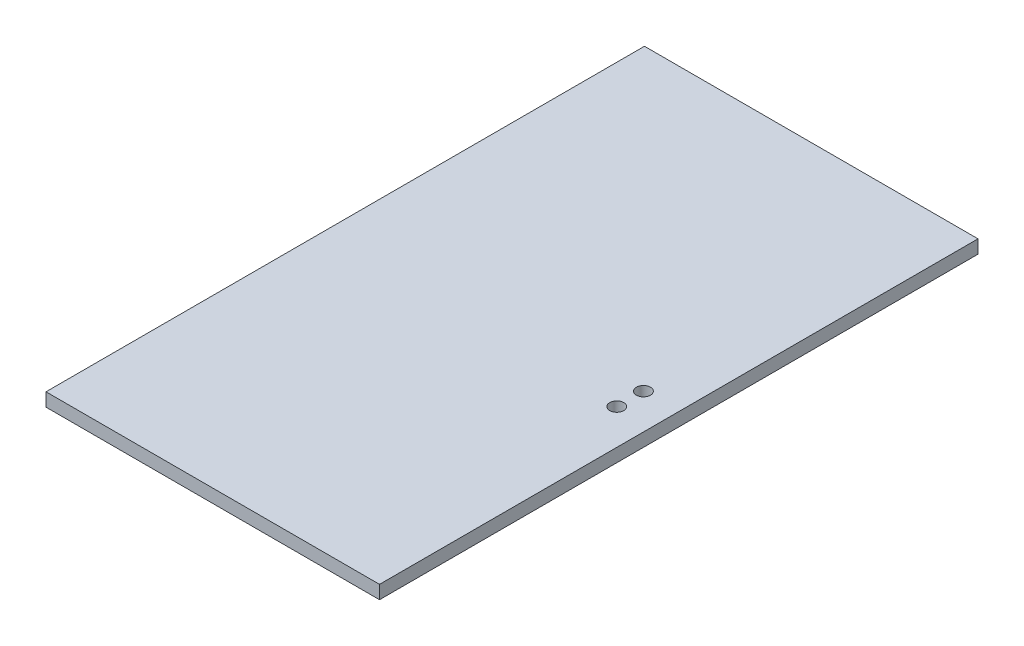
ISO-10303-21;
HEADER;
FILE_DESCRIPTION(('STEP AP214'),'2;1');
FILE_NAME('part.step','',(''),(''),'','','');
FILE_SCHEMA(('AUTOMOTIVE_DESIGN { 1 0 10303 214 1 1 1 1 }'));
ENDSEC;
DATA;
#1=APPLICATION_CONTEXT('core data for automotive mechanical design processes');
#2=APPLICATION_PROTOCOL_DEFINITION('international standard','automotive_design',2000,#1);
#3=PRODUCT_CONTEXT('',#1,'mechanical');
#4=PRODUCT('Part','Part','',(#3));
#5=PRODUCT_RELATED_PRODUCT_CATEGORY('part','',(#4));
#6=PRODUCT_DEFINITION_FORMATION('','',#4);
#7=PRODUCT_DEFINITION_CONTEXT('part definition',#1,'design');
#8=PRODUCT_DEFINITION('design','',#6,#7);
#9=PRODUCT_DEFINITION_SHAPE('','',#8);
#10=(LENGTH_UNIT() NAMED_UNIT(*) SI_UNIT(.MILLI.,.METRE.));
#11=(NAMED_UNIT(*) PLANE_ANGLE_UNIT() SI_UNIT($,.RADIAN.));
#12=(NAMED_UNIT(*) SI_UNIT($,.STERADIAN.) SOLID_ANGLE_UNIT());
#13=UNCERTAINTY_MEASURE_WITH_UNIT(LENGTH_MEASURE(1.E-05),#10,'distance_accuracy_value','');
#14=(GEOMETRIC_REPRESENTATION_CONTEXT(3) GLOBAL_UNCERTAINTY_ASSIGNED_CONTEXT((#13)) GLOBAL_UNIT_ASSIGNED_CONTEXT((#10,
#11,#12)) REPRESENTATION_CONTEXT('',''));
#15=CARTESIAN_POINT('',(0.,0.,0.));
#16=DIRECTION('',(0.,0.,1.));
#17=DIRECTION('',(1.,0.,0.));
#18=AXIS2_PLACEMENT_3D('',#15,#16,#17);
#19=CARTESIAN_POINT('',(75.,0.,0.));
#20=DIRECTION('',(0.,1.,0.));
#21=DIRECTION('',(0.,0.,1.));
#22=AXIS2_PLACEMENT_3D('',#19,#20,#21);
#23=PLANE('',#22);
#24=CARTESIAN_POINT('',(67.0591774961835,0.,-61.29));
#25=DIRECTION('',(0.,1.,0.));
#26=DIRECTION('',(0.,0.,1.));
#27=AXIS2_PLACEMENT_3D('',#24,#25,#26);
#28=CIRCLE('',#27,1.57499999999999);
#29=CARTESIAN_POINT('',(67.0591774961835,0.,-59.715));
#30=VERTEX_POINT('',#29);
#31=EDGE_CURVE('E190',#30,#30,#28,.T.);
#32=ORIENTED_EDGE('',*,*,#31,.T.);
#33=EDGE_LOOP('',(#32));
#34=FACE_BOUND('',#33,.T.);
#35=CARTESIAN_POINT('',(67.0591774961835,0.,-67.29));
#36=DIRECTION('',(0.,1.,0.));
#37=DIRECTION('',(0.,0.,1.));
#38=AXIS2_PLACEMENT_3D('',#35,#36,#37);
#39=CIRCLE('',#38,1.57499999999999);
#40=CARTESIAN_POINT('',(67.0591774961835,0.,-65.715));
#41=VERTEX_POINT('',#40);
#42=EDGE_CURVE('E271',#41,#41,#39,.T.);
#43=ORIENTED_EDGE('',*,*,#42,.T.);
#44=EDGE_LOOP('',(#43));
#45=FACE_BOUND('',#44,.T.);
#46=DIRECTION('',(-1.,0.,0.));
#47=VECTOR('',#46,1.);
#48=CARTESIAN_POINT('',(0.,0.,-12.1));
#49=LINE('',#48,#47);
#50=CARTESIAN_POINT('',(3.,0.,-12.1));
#51=VERTEX_POINT('',#50);
#52=CARTESIAN_POINT('',(0.,0.,-12.1));
#53=VERTEX_POINT('',#52);
#54=EDGE_CURVE('E56',#51,#53,#49,.T.);
#55=ORIENTED_EDGE('',*,*,#54,.F.);
#56=DIRECTION('',(0.,0.,1.));
#57=VECTOR('',#56,1.);
#58=CARTESIAN_POINT('',(3.,0.,-12.1));
#59=LINE('',#58,#57);
#60=CARTESIAN_POINT('',(3.00000000000001,0.,-47.1));
#61=VERTEX_POINT('',#60);
#62=EDGE_CURVE('E202',#61,#51,#59,.T.);
#63=ORIENTED_EDGE('',*,*,#62,.F.);
#64=DIRECTION('',(1.,0.,0.));
#65=VECTOR('',#64,1.);
#66=CARTESIAN_POINT('',(0.,0.,-47.1));
#67=LINE('',#66,#65);
#68=CARTESIAN_POINT('',(0.,0.,-47.1));
#69=VERTEX_POINT('',#68);
#70=EDGE_CURVE('E62',#69,#61,#67,.T.);
#71=ORIENTED_EDGE('',*,*,#70,.F.);
#72=DIRECTION('',(0.,0.,-1.));
#73=VECTOR('',#72,1.);
#74=CARTESIAN_POINT('',(0.,0.,0.));
#75=LINE('',#74,#73);
#76=CARTESIAN_POINT('',(0.,0.,-134.58));
#77=VERTEX_POINT('',#76);
#78=EDGE_CURVE('E130',#69,#77,#75,.T.);
#79=ORIENTED_EDGE('',*,*,#78,.T.);
#80=DIRECTION('',(-1.,0.,0.));
#81=VECTOR('',#80,1.);
#82=CARTESIAN_POINT('',(75.,0.,-134.58));
#83=LINE('',#82,#81);
#84=CARTESIAN_POINT('',(75.,0.,-134.58));
#85=VERTEX_POINT('',#84);
#86=EDGE_CURVE('E48',#85,#77,#83,.T.);
#87=ORIENTED_EDGE('',*,*,#86,.F.);
#88=DIRECTION('',(0.,0.,-1.));
#89=VECTOR('',#88,1.);
#90=CARTESIAN_POINT('',(75.,0.,0.));
#91=LINE('',#90,#89);
#92=CARTESIAN_POINT('',(75.,0.,0.));
#93=VERTEX_POINT('',#92);
#94=EDGE_CURVE('E146',#93,#85,#91,.T.);
#95=ORIENTED_EDGE('',*,*,#94,.F.);
#96=DIRECTION('',(-1.,0.,0.));
#97=VECTOR('',#96,1.);
#98=CARTESIAN_POINT('',(75.,0.,0.));
#99=LINE('',#98,#97);
#100=CARTESIAN_POINT('',(0.,0.,0.));
#101=VERTEX_POINT('',#100);
#102=EDGE_CURVE('E11',#93,#101,#99,.T.);
#103=ORIENTED_EDGE('',*,*,#102,.T.);
#104=EDGE_CURVE('E157',#101,#53,#75,.T.);
#105=ORIENTED_EDGE('',*,*,#104,.T.);
#106=EDGE_LOOP('',(#55,#63,#71,#79,#87,#95,#103,#105));
#107=FACE_BOUND('',#106,.T.);
#108=ADVANCED_FACE('F38',(#34,#45,#107),#23,.F.);
#109=CARTESIAN_POINT('',(75.,0.,0.));
#110=DIRECTION('',(0.,0.,-1.));
#111=DIRECTION('',(-1.,0.,0.));
#112=AXIS2_PLACEMENT_3D('',#109,#110,#111);
#113=PLANE('',#112);
#114=DIRECTION('',(0.,-1.,0.));
#115=VECTOR('',#114,1.);
#116=CARTESIAN_POINT('',(0.,0.,0.));
#117=LINE('',#116,#115);
#118=CARTESIAN_POINT('',(0.,3.,0.));
#119=VERTEX_POINT('',#118);
#120=EDGE_CURVE('E132',#119,#101,#117,.T.);
#121=ORIENTED_EDGE('',*,*,#120,.T.);
#122=ORIENTED_EDGE('',*,*,#102,.F.);
#123=DIRECTION('',(0.,-1.,0.));
#124=VECTOR('',#123,1.);
#125=CARTESIAN_POINT('',(75.,0.,0.));
#126=LINE('',#125,#124);
#127=CARTESIAN_POINT('',(75.,3.,0.));
#128=VERTEX_POINT('',#127);
#129=EDGE_CURVE('E142',#128,#93,#126,.T.);
#130=ORIENTED_EDGE('',*,*,#129,.F.);
#131=DIRECTION('',(-1.,0.,0.));
#132=VECTOR('',#131,1.);
#133=CARTESIAN_POINT('',(75.,3.,0.));
#134=LINE('',#133,#132);
#135=EDGE_CURVE('E155',#128,#119,#134,.T.);
#136=ORIENTED_EDGE('',*,*,#135,.T.);
#137=EDGE_LOOP('',(#121,#122,#130,#136));
#138=FACE_BOUND('',#137,.T.);
#139=ADVANCED_FACE('F40',(#138),#113,.F.);
#140=CARTESIAN_POINT('',(75.,0.,-134.58));
#141=DIRECTION('',(0.,0.,1.));
#142=DIRECTION('',(1.,0.,0.));
#143=AXIS2_PLACEMENT_3D('',#140,#141,#142);
#144=PLANE('',#143);
#145=DIRECTION('',(0.,1.,0.));
#146=VECTOR('',#145,1.);
#147=CARTESIAN_POINT('',(0.,0.,-134.58));
#148=LINE('',#147,#146);
#149=CARTESIAN_POINT('',(0.,3.,-134.58));
#150=VERTEX_POINT('',#149);
#151=EDGE_CURVE('E160',#77,#150,#148,.T.);
#152=ORIENTED_EDGE('',*,*,#151,.T.);
#153=DIRECTION('',(-1.,0.,0.));
#154=VECTOR('',#153,1.);
#155=CARTESIAN_POINT('',(75.,3.,-134.58));
#156=LINE('',#155,#154);
#157=CARTESIAN_POINT('',(75.,3.,-134.58));
#158=VERTEX_POINT('',#157);
#159=EDGE_CURVE('E168',#158,#150,#156,.T.);
#160=ORIENTED_EDGE('',*,*,#159,.F.);
#161=DIRECTION('',(0.,1.,0.));
#162=VECTOR('',#161,1.);
#163=CARTESIAN_POINT('',(75.,0.,-134.58));
#164=LINE('',#163,#162);
#165=EDGE_CURVE('E150',#85,#158,#164,.T.);
#166=ORIENTED_EDGE('',*,*,#165,.F.);
#167=ORIENTED_EDGE('',*,*,#86,.T.);
#168=EDGE_LOOP('',(#152,#160,#166,#167));
#169=FACE_BOUND('',#168,.T.);
#170=ADVANCED_FACE('F222',(#169),#144,.F.);
#171=CARTESIAN_POINT('',(75.,3.,0.));
#172=DIRECTION('',(0.,-1.,0.));
#173=DIRECTION('',(0.,0.,-1.));
#174=AXIS2_PLACEMENT_3D('',#171,#172,#173);
#175=PLANE('',#174);
#176=CARTESIAN_POINT('',(67.0591774961835,3.,-61.29));
#177=DIRECTION('',(0.,1.,0.));
#178=DIRECTION('',(0.,0.,1.));
#179=AXIS2_PLACEMENT_3D('',#176,#177,#178);
#180=CIRCLE('',#179,1.57499999999999);
#181=CARTESIAN_POINT('',(67.0591774961835,3.,-59.715));
#182=VERTEX_POINT('',#181);
#183=EDGE_CURVE('E268',#182,#182,#180,.T.);
#184=ORIENTED_EDGE('',*,*,#183,.F.);
#185=EDGE_LOOP('',(#184));
#186=FACE_BOUND('',#185,.T.);
#187=CARTESIAN_POINT('',(67.0591774961835,3.,-67.29));
#188=DIRECTION('',(0.,1.,0.));
#189=DIRECTION('',(0.,0.,1.));
#190=AXIS2_PLACEMENT_3D('',#187,#188,#189);
#191=CIRCLE('',#190,1.57499999999999);
#192=CARTESIAN_POINT('',(67.0591774961835,3.,-65.715));
#193=VERTEX_POINT('',#192);
#194=EDGE_CURVE('E276',#193,#193,#191,.T.);
#195=ORIENTED_EDGE('',*,*,#194,.F.);
#196=EDGE_LOOP('',(#195));
#197=FACE_BOUND('',#196,.T.);
#198=DIRECTION('',(0.,0.,1.));
#199=VECTOR('',#198,1.);
#200=CARTESIAN_POINT('',(0.,3.,0.));
#201=LINE('',#200,#199);
#202=EDGE_CURVE('E147',#150,#119,#201,.T.);
#203=ORIENTED_EDGE('',*,*,#202,.T.);
#204=ORIENTED_EDGE('',*,*,#135,.F.);
#205=DIRECTION('',(0.,0.,1.));
#206=VECTOR('',#205,1.);
#207=CARTESIAN_POINT('',(75.,3.,0.));
#208=LINE('',#207,#206);
#209=EDGE_CURVE('E153',#158,#128,#208,.T.);
#210=ORIENTED_EDGE('',*,*,#209,.F.);
#211=ORIENTED_EDGE('',*,*,#159,.T.);
#212=EDGE_LOOP('',(#203,#204,#210,#211));
#213=FACE_BOUND('',#212,.T.);
#214=ADVANCED_FACE('F229',(#186,#197,#213),#175,.F.);
#215=CARTESIAN_POINT('',(75.,0.,0.));
#216=DIRECTION('',(-1.,0.,0.));
#217=DIRECTION('',(0.,0.,1.));
#218=AXIS2_PLACEMENT_3D('',#215,#216,#217);
#219=PLANE('',#218);
#220=ORIENTED_EDGE('',*,*,#129,.T.);
#221=ORIENTED_EDGE('',*,*,#94,.T.);
#222=ORIENTED_EDGE('',*,*,#165,.T.);
#223=ORIENTED_EDGE('',*,*,#209,.T.);
#224=EDGE_LOOP('',(#220,#221,#222,#223));
#225=FACE_BOUND('',#224,.T.);
#226=ADVANCED_FACE('F232',(#225),#219,.F.);
#227=CARTESIAN_POINT('',(0.,0.,0.));
#228=DIRECTION('',(-1.,0.,0.));
#229=DIRECTION('',(0.,0.,1.));
#230=AXIS2_PLACEMENT_3D('',#227,#228,#229);
#231=PLANE('',#230);
#232=CARTESIAN_POINT('',(0.,-4.5,-23.7666666666667));
#233=DIRECTION('',(-1.,0.,0.));
#234=DIRECTION('',(0.,0.,1.));
#235=AXIS2_PLACEMENT_3D('',#232,#233,#234);
#236=CIRCLE('',#235,1.575);
#237=CARTESIAN_POINT('',(0.,-4.5,-22.1916666666667));
#238=VERTEX_POINT('',#237);
#239=EDGE_CURVE('E177',#238,#238,#236,.T.);
#240=ORIENTED_EDGE('',*,*,#239,.F.);
#241=EDGE_LOOP('',(#240));
#242=FACE_BOUND('',#241,.T.);
#243=CARTESIAN_POINT('',(0.,-4.5,-35.4333333333333));
#244=DIRECTION('',(-1.,0.,0.));
#245=DIRECTION('',(0.,0.,1.));
#246=AXIS2_PLACEMENT_3D('',#243,#244,#245);
#247=CIRCLE('',#246,1.575);
#248=CARTESIAN_POINT('',(0.,-4.5,-33.8583333333333));
#249=VERTEX_POINT('',#248);
#250=EDGE_CURVE('E184',#249,#249,#247,.T.);
#251=ORIENTED_EDGE('',*,*,#250,.F.);
#252=EDGE_LOOP('',(#251));
#253=FACE_BOUND('',#252,.T.);
#254=ORIENTED_EDGE('',*,*,#120,.F.);
#255=ORIENTED_EDGE('',*,*,#202,.F.);
#256=ORIENTED_EDGE('',*,*,#151,.F.);
#257=ORIENTED_EDGE('',*,*,#78,.F.);
#258=DIRECTION('',(0.,1.,0.));
#259=VECTOR('',#258,1.);
#260=CARTESIAN_POINT('',(0.,-9.,-47.1));
#261=LINE('',#260,#259);
#262=CARTESIAN_POINT('',(0.,-9.,-47.1));
#263=VERTEX_POINT('',#262);
#264=EDGE_CURVE('E109',#263,#69,#261,.T.);
#265=ORIENTED_EDGE('',*,*,#264,.F.);
#266=DIRECTION('',(0.,0.,-1.));
#267=VECTOR('',#266,1.);
#268=CARTESIAN_POINT('',(0.,-9.,-12.1));
#269=LINE('',#268,#267);
#270=CARTESIAN_POINT('',(0.,-9.,-12.1));
#271=VERTEX_POINT('',#270);
#272=EDGE_CURVE('E116',#271,#263,#269,.T.);
#273=ORIENTED_EDGE('',*,*,#272,.F.);
#274=DIRECTION('',(0.,1.,0.));
#275=VECTOR('',#274,1.);
#276=CARTESIAN_POINT('',(0.,-9.,-12.1));
#277=LINE('',#276,#275);
#278=EDGE_CURVE('E199',#271,#53,#277,.T.);
#279=ORIENTED_EDGE('',*,*,#278,.T.);
#280=ORIENTED_EDGE('',*,*,#104,.F.);
#281=EDGE_LOOP('',(#254,#255,#256,#257,#265,#273,#279,#280));
#282=FACE_BOUND('',#281,.T.);
#283=ADVANCED_FACE('F128',(#242,#253,#282),#231,.T.);
#284=CARTESIAN_POINT('',(0.,-9.,-47.1));
#285=DIRECTION('',(0.,0.,1.));
#286=DIRECTION('',(1.,0.,0.));
#287=AXIS2_PLACEMENT_3D('',#284,#285,#286);
#288=PLANE('',#287);
#289=ORIENTED_EDGE('',*,*,#70,.T.);
#290=DIRECTION('',(0.,1.,0.));
#291=VECTOR('',#290,1.);
#292=CARTESIAN_POINT('',(3.00000000000001,-9.,-47.1));
#293=LINE('',#292,#291);
#294=CARTESIAN_POINT('',(3.00000000000001,-9.,-47.1));
#295=VERTEX_POINT('',#294);
#296=EDGE_CURVE('E111',#295,#61,#293,.T.);
#297=ORIENTED_EDGE('',*,*,#296,.F.);
#298=DIRECTION('',(1.,0.,0.));
#299=VECTOR('',#298,1.);
#300=CARTESIAN_POINT('',(0.,-9.,-47.1));
#301=LINE('',#300,#299);
#302=EDGE_CURVE('E105',#263,#295,#301,.T.);
#303=ORIENTED_EDGE('',*,*,#302,.F.);
#304=ORIENTED_EDGE('',*,*,#264,.T.);
#305=EDGE_LOOP('',(#289,#297,#303,#304));
#306=FACE_BOUND('',#305,.T.);
#307=ADVANCED_FACE('F107',(#306),#288,.F.);
#308=CARTESIAN_POINT('',(3.,-9.,-12.1));
#309=DIRECTION('',(-1.,0.,0.));
#310=DIRECTION('',(0.,0.,1.));
#311=AXIS2_PLACEMENT_3D('',#308,#309,#310);
#312=PLANE('',#311);
#313=CARTESIAN_POINT('',(3.,-4.5,-23.7666666666667));
#314=DIRECTION('',(-1.,0.,0.));
#315=DIRECTION('',(0.,0.,1.));
#316=AXIS2_PLACEMENT_3D('',#313,#314,#315);
#317=CIRCLE('',#316,1.575);
#318=CARTESIAN_POINT('',(3.,-4.5,-22.1916666666667));
#319=VERTEX_POINT('',#318);
#320=EDGE_CURVE('E42',#319,#319,#317,.T.);
#321=ORIENTED_EDGE('',*,*,#320,.T.);
#322=EDGE_LOOP('',(#321));
#323=FACE_BOUND('',#322,.T.);
#324=CARTESIAN_POINT('',(3.00000000000002,-4.5,-35.4333333333333));
#325=DIRECTION('',(-1.,0.,0.));
#326=DIRECTION('',(0.,0.,1.));
#327=AXIS2_PLACEMENT_3D('',#324,#325,#326);
#328=CIRCLE('',#327,1.575);
#329=CARTESIAN_POINT('',(3.00000000000002,-4.5,-33.8583333333333));
#330=VERTEX_POINT('',#329);
#331=EDGE_CURVE('E174',#330,#330,#328,.T.);
#332=ORIENTED_EDGE('',*,*,#331,.T.);
#333=EDGE_LOOP('',(#332));
#334=FACE_BOUND('',#333,.T.);
#335=ORIENTED_EDGE('',*,*,#62,.T.);
#336=DIRECTION('',(0.,1.,0.));
#337=VECTOR('',#336,1.);
#338=CARTESIAN_POINT('',(3.,-9.,-12.1));
#339=LINE('',#338,#337);
#340=CARTESIAN_POINT('',(3.,-9.,-12.1));
#341=VERTEX_POINT('',#340);
#342=EDGE_CURVE('E138',#341,#51,#339,.T.);
#343=ORIENTED_EDGE('',*,*,#342,.F.);
#344=DIRECTION('',(0.,0.,1.));
#345=VECTOR('',#344,1.);
#346=CARTESIAN_POINT('',(3.,-9.,-12.1));
#347=LINE('',#346,#345);
#348=EDGE_CURVE('E115',#295,#341,#347,.T.);
#349=ORIENTED_EDGE('',*,*,#348,.F.);
#350=ORIENTED_EDGE('',*,*,#296,.T.);
#351=EDGE_LOOP('',(#335,#343,#349,#350));
#352=FACE_BOUND('',#351,.T.);
#353=ADVANCED_FACE('F214',(#323,#334,#352),#312,.F.);
#354=CARTESIAN_POINT('',(0.,-9.,-12.1));
#355=DIRECTION('',(0.,0.,-1.));
#356=DIRECTION('',(-1.,0.,0.));
#357=AXIS2_PLACEMENT_3D('',#354,#355,#356);
#358=PLANE('',#357);
#359=ORIENTED_EDGE('',*,*,#54,.T.);
#360=ORIENTED_EDGE('',*,*,#278,.F.);
#361=DIRECTION('',(-1.,0.,0.));
#362=VECTOR('',#361,1.);
#363=CARTESIAN_POINT('',(0.,-9.,-12.1));
#364=LINE('',#363,#362);
#365=EDGE_CURVE('E121',#341,#271,#364,.T.);
#366=ORIENTED_EDGE('',*,*,#365,.F.);
#367=ORIENTED_EDGE('',*,*,#342,.T.);
#368=EDGE_LOOP('',(#359,#360,#366,#367));
#369=FACE_BOUND('',#368,.T.);
#370=ADVANCED_FACE('F212',(#369),#358,.F.);
#371=CARTESIAN_POINT('',(0.,-9.,0.));
#372=DIRECTION('',(0.,-1.,0.));
#373=DIRECTION('',(0.,0.,-1.));
#374=AXIS2_PLACEMENT_3D('',#371,#372,#373);
#375=PLANE('',#374);
#376=ORIENTED_EDGE('',*,*,#272,.T.);
#377=ORIENTED_EDGE('',*,*,#302,.T.);
#378=ORIENTED_EDGE('',*,*,#348,.T.);
#379=ORIENTED_EDGE('',*,*,#365,.T.);
#380=EDGE_LOOP('',(#376,#377,#378,#379));
#381=FACE_BOUND('',#380,.T.);
#382=ADVANCED_FACE('F119',(#381),#375,.T.);
#383=CARTESIAN_POINT('',(75.,-4.5,-35.4333333333333));
#384=DIRECTION('',(-1.,0.,0.));
#385=DIRECTION('',(0.,0.,1.));
#386=AXIS2_PLACEMENT_3D('',#383,#384,#385);
#387=CYLINDRICAL_SURFACE('',#386,1.575);
#388=ORIENTED_EDGE('',*,*,#250,.T.);
#389=EDGE_LOOP('',(#388));
#390=FACE_BOUND('',#389,.T.);
#391=ORIENTED_EDGE('',*,*,#331,.F.);
#392=EDGE_LOOP('',(#391));
#393=FACE_BOUND('',#392,.T.);
#394=ADVANCED_FACE('F249',(#390,#393),#387,.F.);
#395=CARTESIAN_POINT('',(75.,-4.5,-23.7666666666667));
#396=DIRECTION('',(-1.,0.,0.));
#397=DIRECTION('',(0.,0.,1.));
#398=AXIS2_PLACEMENT_3D('',#395,#396,#397);
#399=CYLINDRICAL_SURFACE('',#398,1.575);
#400=ORIENTED_EDGE('',*,*,#239,.T.);
#401=EDGE_LOOP('',(#400));
#402=FACE_BOUND('',#401,.T.);
#403=ORIENTED_EDGE('',*,*,#320,.F.);
#404=EDGE_LOOP('',(#403));
#405=FACE_BOUND('',#404,.T.);
#406=ADVANCED_FACE('F252',(#402,#405),#399,.F.);
#407=CARTESIAN_POINT('',(67.0591774961835,-9.,-67.29));
#408=DIRECTION('',(0.,1.,0.));
#409=DIRECTION('',(0.,0.,1.));
#410=AXIS2_PLACEMENT_3D('',#407,#408,#409);
#411=CYLINDRICAL_SURFACE('',#410,1.57499999999999);
#412=ORIENTED_EDGE('',*,*,#194,.T.);
#413=EDGE_LOOP('',(#412));
#414=FACE_BOUND('',#413,.T.);
#415=ORIENTED_EDGE('',*,*,#42,.F.);
#416=EDGE_LOOP('',(#415));
#417=FACE_BOUND('',#416,.T.);
#418=ADVANCED_FACE('F256',(#414,#417),#411,.F.);
#419=CARTESIAN_POINT('',(67.0591774961835,-9.,-61.29));
#420=DIRECTION('',(0.,1.,0.));
#421=DIRECTION('',(0.,0.,1.));
#422=AXIS2_PLACEMENT_3D('',#419,#420,#421);
#423=CYLINDRICAL_SURFACE('',#422,1.57499999999999);
#424=ORIENTED_EDGE('',*,*,#183,.T.);
#425=EDGE_LOOP('',(#424));
#426=FACE_BOUND('',#425,.T.);
#427=ORIENTED_EDGE('',*,*,#31,.F.);
#428=EDGE_LOOP('',(#427));
#429=FACE_BOUND('',#428,.T.);
#430=ADVANCED_FACE('F259',(#426,#429),#423,.F.);
#431=CLOSED_SHELL('',(#108,#139,#170,#214,#226,#283,#307,#353,#370,#382,#394,#406,#418,#430));
#432=MANIFOLD_SOLID_BREP('B2',#431);
#433=ADVANCED_BREP_SHAPE_REPRESENTATION('',(#18,#432),#14);
#434=SHAPE_DEFINITION_REPRESENTATION(#9,#433);
ENDSEC;
END-ISO-10303-21;
